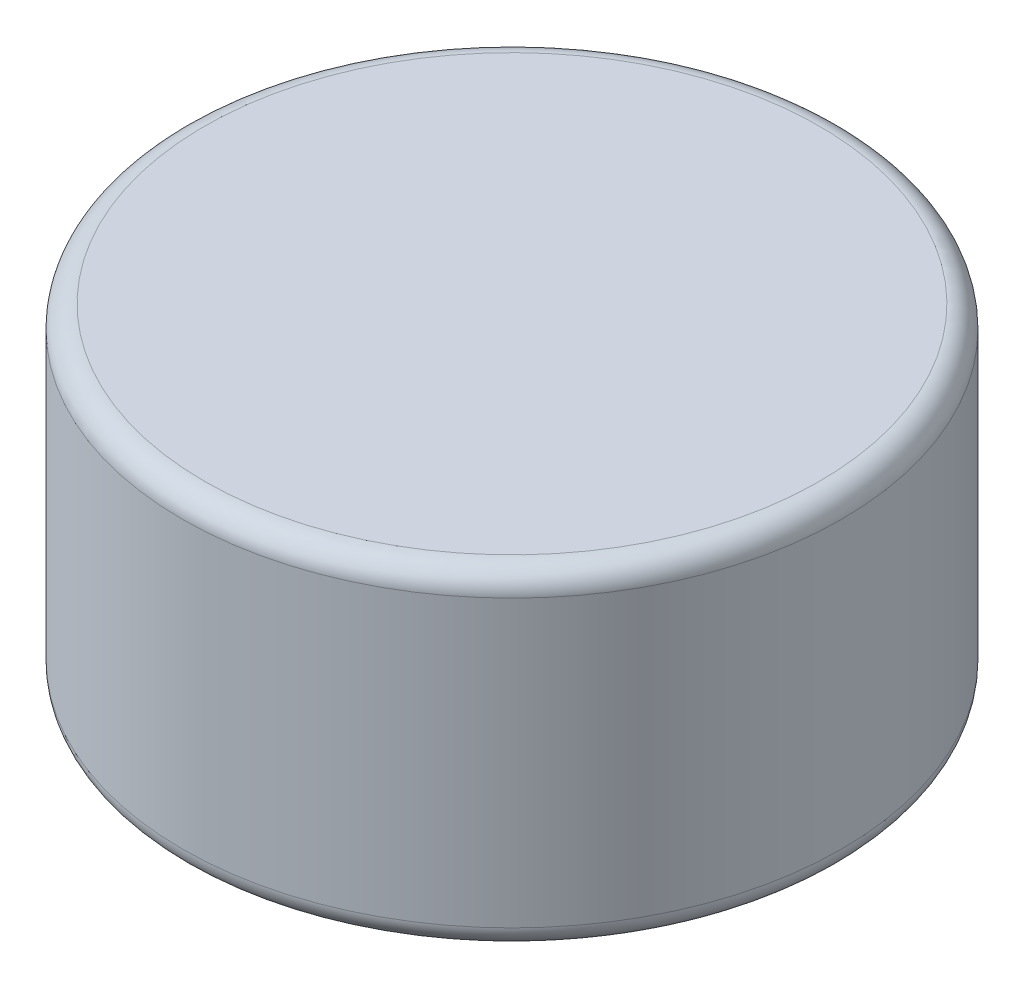
ISO-10303-21;
HEADER;
FILE_DESCRIPTION(('STEP AP214'),'2;1');
FILE_NAME('part.step','',(''),(''),'','','');
FILE_SCHEMA(('AUTOMOTIVE_DESIGN { 1 0 10303 214 1 1 1 1 }'));
ENDSEC;
DATA;
#1=APPLICATION_CONTEXT('core data for automotive mechanical design processes');
#2=APPLICATION_PROTOCOL_DEFINITION('international standard','automotive_design',2000,#1);
#3=PRODUCT_CONTEXT('',#1,'mechanical');
#4=PRODUCT('Part','Part','',(#3));
#5=PRODUCT_RELATED_PRODUCT_CATEGORY('part','',(#4));
#6=PRODUCT_DEFINITION_FORMATION('','',#4);
#7=PRODUCT_DEFINITION_CONTEXT('part definition',#1,'design');
#8=PRODUCT_DEFINITION('design','',#6,#7);
#9=PRODUCT_DEFINITION_SHAPE('','',#8);
#10=(LENGTH_UNIT() NAMED_UNIT(*) SI_UNIT(.MILLI.,.METRE.));
#11=(NAMED_UNIT(*) PLANE_ANGLE_UNIT() SI_UNIT($,.RADIAN.));
#12=(NAMED_UNIT(*) SI_UNIT($,.STERADIAN.) SOLID_ANGLE_UNIT());
#13=UNCERTAINTY_MEASURE_WITH_UNIT(LENGTH_MEASURE(1.E-05),#10,'distance_accuracy_value','');
#14=(GEOMETRIC_REPRESENTATION_CONTEXT(3) GLOBAL_UNCERTAINTY_ASSIGNED_CONTEXT((#13)) GLOBAL_UNIT_ASSIGNED_CONTEXT((#10,
#11,#12)) REPRESENTATION_CONTEXT('',''));
#15=CARTESIAN_POINT('',(0.,0.,0.));
#16=DIRECTION('',(0.,0.,1.));
#17=DIRECTION('',(1.,0.,0.));
#18=AXIS2_PLACEMENT_3D('',#15,#16,#17);
#19=CARTESIAN_POINT('',(0.,3.,0.));
#20=DIRECTION('',(0.,-1.,0.));
#21=DIRECTION('',(0.,0.,-1.));
#22=AXIS2_PLACEMENT_3D('',#19,#20,#21);
#23=CYLINDRICAL_SURFACE('',#22,3.);
#24=CARTESIAN_POINT('',(0.,2.8,0.));
#25=DIRECTION('',(0.,1.,0.));
#26=DIRECTION('',(0.,0.,1.));
#27=AXIS2_PLACEMENT_3D('',#24,#25,#26);
#28=CIRCLE('',#27,3.);
#29=CARTESIAN_POINT('',(0.,2.8,3.));
#30=VERTEX_POINT('',#29);
#31=EDGE_CURVE('E43',#30,#30,#28,.F.);
#32=ORIENTED_EDGE('',*,*,#31,.T.);
#33=EDGE_LOOP('',(#32));
#34=FACE_BOUND('',#33,.T.);
#35=CARTESIAN_POINT('',(0.,0.2,0.));
#36=DIRECTION('',(0.,1.,0.));
#37=DIRECTION('',(0.,0.,1.));
#38=AXIS2_PLACEMENT_3D('',#35,#36,#37);
#39=CIRCLE('',#38,3.);
#40=CARTESIAN_POINT('',(0.,0.2,3.));
#41=VERTEX_POINT('',#40);
#42=EDGE_CURVE('E47',#41,#41,#39,.T.);
#43=ORIENTED_EDGE('',*,*,#42,.T.);
#44=EDGE_LOOP('',(#43));
#45=FACE_BOUND('',#44,.T.);
#46=ADVANCED_FACE('F36',(#34,#45),#23,.T.);
#47=CARTESIAN_POINT('',(0.,3.,0.));
#48=DIRECTION('',(0.,1.,0.));
#49=DIRECTION('',(0.,0.,1.));
#50=AXIS2_PLACEMENT_3D('',#47,#48,#49);
#51=PLANE('',#50);
#52=CARTESIAN_POINT('',(0.,3.,0.));
#53=DIRECTION('',(0.,1.,0.));
#54=DIRECTION('',(0.,0.,1.));
#55=AXIS2_PLACEMENT_3D('',#52,#53,#54);
#56=CIRCLE('',#55,2.8);
#57=CARTESIAN_POINT('',(0.,3.,2.8));
#58=VERTEX_POINT('',#57);
#59=EDGE_CURVE('E51',#58,#58,#56,.T.);
#60=ORIENTED_EDGE('',*,*,#59,.T.);
#61=EDGE_LOOP('',(#60));
#62=FACE_BOUND('',#61,.T.);
#63=ADVANCED_FACE('F57',(#62),#51,.T.);
#64=CARTESIAN_POINT('',(0.,0.,0.));
#65=DIRECTION('',(0.,1.,0.));
#66=DIRECTION('',(0.,0.,1.));
#67=AXIS2_PLACEMENT_3D('',#64,#65,#66);
#68=PLANE('',#67);
#69=CARTESIAN_POINT('',(0.,0.,0.));
#70=DIRECTION('',(0.,1.,0.));
#71=DIRECTION('',(0.,0.,1.));
#72=AXIS2_PLACEMENT_3D('',#69,#70,#71);
#73=CIRCLE('',#72,2.8);
#74=CARTESIAN_POINT('',(0.,0.,2.8));
#75=VERTEX_POINT('',#74);
#76=EDGE_CURVE('E10',#75,#75,#73,.F.);
#77=ORIENTED_EDGE('',*,*,#76,.T.);
#78=EDGE_LOOP('',(#77));
#79=FACE_BOUND('',#78,.T.);
#80=ADVANCED_FACE('F61',(#79),#68,.F.);
#81=CARTESIAN_POINT('',(0.,2.8,0.));
#82=DIRECTION('',(0.,1.,0.));
#83=DIRECTION('',(0.,0.,1.));
#84=AXIS2_PLACEMENT_3D('',#81,#82,#83);
#85=TOROIDAL_SURFACE('',#84,2.8,0.2);
#86=ORIENTED_EDGE('',*,*,#31,.F.);
#87=EDGE_LOOP('',(#86));
#88=FACE_BOUND('',#87,.T.);
#89=ORIENTED_EDGE('',*,*,#59,.F.);
#90=EDGE_LOOP('',(#89));
#91=FACE_BOUND('',#90,.T.);
#92=ADVANCED_FACE('F59',(#88,#91),#85,.T.);
#93=CARTESIAN_POINT('',(0.,0.2,0.));
#94=DIRECTION('',(0.,1.,0.));
#95=DIRECTION('',(0.,0.,1.));
#96=AXIS2_PLACEMENT_3D('',#93,#94,#95);
#97=TOROIDAL_SURFACE('',#96,2.8,0.2);
#98=ORIENTED_EDGE('',*,*,#76,.F.);
#99=EDGE_LOOP('',(#98));
#100=FACE_BOUND('',#99,.T.);
#101=ORIENTED_EDGE('',*,*,#42,.F.);
#102=EDGE_LOOP('',(#101));
#103=FACE_BOUND('',#102,.T.);
#104=ADVANCED_FACE('F38',(#100,#103),#97,.T.);
#105=CLOSED_SHELL('',(#46,#63,#80,#92,#104));
#106=MANIFOLD_SOLID_BREP('B2',#105);
#107=ADVANCED_BREP_SHAPE_REPRESENTATION('',(#18,#106),#14);
#108=SHAPE_DEFINITION_REPRESENTATION(#9,#107);
ENDSEC;
END-ISO-10303-21;
